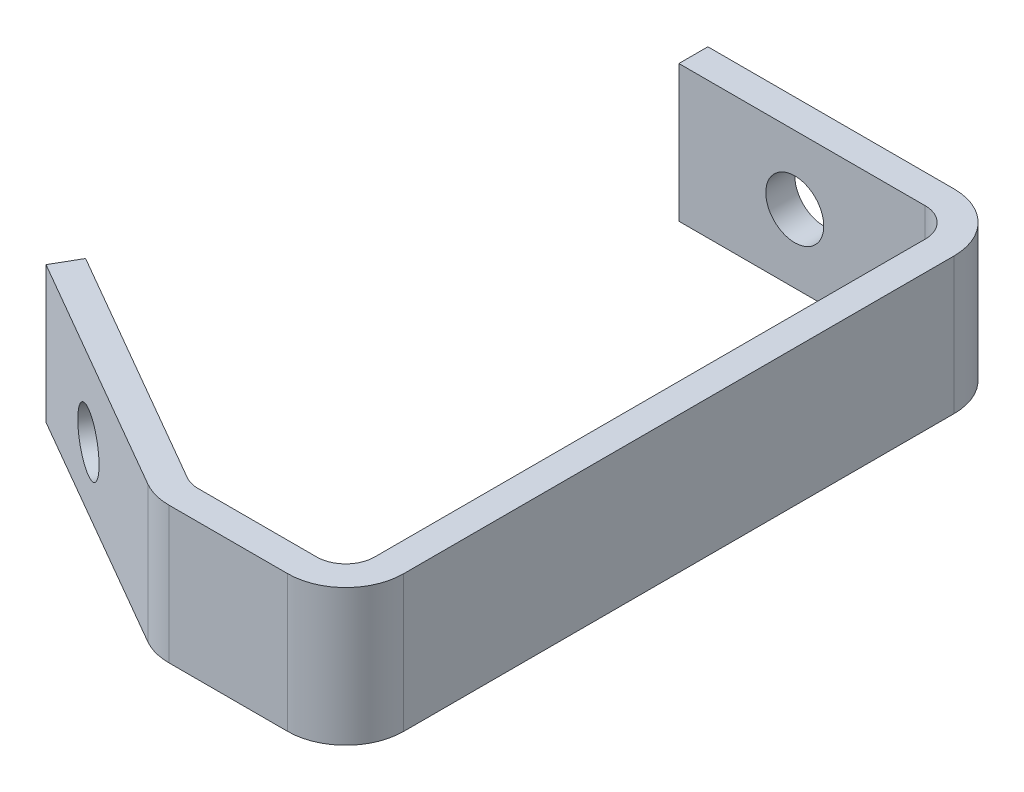
ISO-10303-21;
HEADER;
FILE_DESCRIPTION(('STEP AP214'),'2;1');
FILE_NAME('part.step','',(''),(''),'','','');
FILE_SCHEMA(('AUTOMOTIVE_DESIGN { 1 0 10303 214 1 1 1 1 }'));
ENDSEC;
DATA;
#1=APPLICATION_CONTEXT('core data for automotive mechanical design processes');
#2=APPLICATION_PROTOCOL_DEFINITION('international standard','automotive_design',2000,#1);
#3=PRODUCT_CONTEXT('',#1,'mechanical');
#4=PRODUCT('Part','Part','',(#3));
#5=PRODUCT_RELATED_PRODUCT_CATEGORY('part','',(#4));
#6=PRODUCT_DEFINITION_FORMATION('','',#4);
#7=PRODUCT_DEFINITION_CONTEXT('part definition',#1,'design');
#8=PRODUCT_DEFINITION('design','',#6,#7);
#9=PRODUCT_DEFINITION_SHAPE('','',#8);
#10=(LENGTH_UNIT() NAMED_UNIT(*) SI_UNIT(.MILLI.,.METRE.));
#11=(NAMED_UNIT(*) PLANE_ANGLE_UNIT() SI_UNIT($,.RADIAN.));
#12=(NAMED_UNIT(*) SI_UNIT($,.STERADIAN.) SOLID_ANGLE_UNIT());
#13=UNCERTAINTY_MEASURE_WITH_UNIT(LENGTH_MEASURE(1.E-05),#10,'distance_accuracy_value','');
#14=(GEOMETRIC_REPRESENTATION_CONTEXT(3) GLOBAL_UNCERTAINTY_ASSIGNED_CONTEXT((#13)) GLOBAL_UNIT_ASSIGNED_CONTEXT((#10,
#11,#12)) REPRESENTATION_CONTEXT('',''));
#15=CARTESIAN_POINT('',(0.,0.,0.));
#16=DIRECTION('',(0.,0.,1.));
#17=DIRECTION('',(1.,0.,0.));
#18=AXIS2_PLACEMENT_3D('',#15,#16,#17);
#19=CARTESIAN_POINT('',(-28.75,11.7879879437861,-2.16506350946109));
#20=DIRECTION('',(-0.500000000000001,0.,0.866025403784438));
#21=DIRECTION('',(0.866025403784438,0.,0.500000000000001));
#22=AXIS2_PLACEMENT_3D('',#19,#20,#21);
#23=PLANE('',#22);
#24=CARTESIAN_POINT('',(-54.7307621135332,-1.07656788950194,-17.1650635094611));
#25=DIRECTION('',(-0.500000000000001,0.,0.866025403784438));
#26=DIRECTION('',(0.866025403784438,0.,0.500000000000001));
#27=AXIS2_PLACEMENT_3D('',#24,#25,#26);
#28=CIRCLE('',#27,5.);
#29=CARTESIAN_POINT('',(-50.400635094611,-1.07656788950194,-14.6650635094611));
#30=VERTEX_POINT('',#29);
#31=EDGE_CURVE('E499',#30,#30,#28,.T.);
#32=ORIENTED_EDGE('',*,*,#31,.T.);
#33=EDGE_LOOP('',(#32));
#34=FACE_BOUND('',#33,.T.);
#35=DIRECTION('',(-0.866025403784438,0.,-0.500000000000001));
#36=VECTOR('',#35,1.);
#37=CARTESIAN_POINT('',(-28.75,11.7879879437861,-2.16506350946109));
#38=LINE('',#37,#36);
#39=CARTESIAN_POINT('',(-30.4903810567666,11.7879879437861,-3.1698729810778));
#40=VERTEX_POINT('',#39);
#41=CARTESIAN_POINT('',(-72.0512701892219,11.7879879437861,-27.1650635094611));
#42=VERTEX_POINT('',#41);
#43=EDGE_CURVE('E145',#40,#42,#38,.T.);
#44=ORIENTED_EDGE('',*,*,#43,.F.);
#45=DIRECTION('',(0.,-1.,0.));
#46=VECTOR('',#45,1.);
#47=CARTESIAN_POINT('',(-30.4903810567666,-11.7879879437861,-3.1698729810778));
#48=LINE('',#47,#46);
#49=CARTESIAN_POINT('',(-30.4903810567666,-11.7879879437861,-3.1698729810778));
#50=VERTEX_POINT('',#49);
#51=EDGE_CURVE('E260',#40,#50,#48,.T.);
#52=ORIENTED_EDGE('',*,*,#51,.T.);
#53=DIRECTION('',(-0.866025403784438,0.,-0.500000000000001));
#54=VECTOR('',#53,1.);
#55=CARTESIAN_POINT('',(-28.75,-11.7879879437861,-2.16506350946109));
#56=LINE('',#55,#54);
#57=CARTESIAN_POINT('',(-72.0512701892219,-11.7879879437861,-27.1650635094611));
#58=VERTEX_POINT('',#57);
#59=EDGE_CURVE('E161',#50,#58,#56,.T.);
#60=ORIENTED_EDGE('',*,*,#59,.T.);
#61=DIRECTION('',(0.,-1.,0.));
#62=VECTOR('',#61,1.);
#63=CARTESIAN_POINT('',(-72.0512701892219,11.7879879437861,-27.1650635094611));
#64=LINE('',#63,#62);
#65=EDGE_CURVE('E159',#42,#58,#64,.T.);
#66=ORIENTED_EDGE('',*,*,#65,.F.);
#67=EDGE_LOOP('',(#44,#52,#60,#66));
#68=FACE_BOUND('',#67,.T.);
#69=ADVANCED_FACE('F33',(#34,#68),#23,.F.);
#70=CARTESIAN_POINT('',(-74.551270189222,11.7879879437861,-22.834936490539));
#71=DIRECTION('',(-0.866025403784438,0.,-0.500000000000001));
#72=DIRECTION('',(-0.500000000000001,0.,0.866025403784438));
#73=AXIS2_PLACEMENT_3D('',#70,#71,#72);
#74=PLANE('',#73);
#75=DIRECTION('',(0.500000000000001,0.,-0.866025403784438));
#76=VECTOR('',#75,1.);
#77=CARTESIAN_POINT('',(-74.551270189222,-11.7879879437861,-22.834936490539));
#78=LINE('',#77,#76);
#79=CARTESIAN_POINT('',(-74.551270189222,-11.7879879437861,-22.834936490539));
#80=VERTEX_POINT('',#79);
#81=EDGE_CURVE('E198',#80,#58,#78,.T.);
#82=ORIENTED_EDGE('',*,*,#81,.F.);
#83=DIRECTION('',(0.,-1.,0.));
#84=VECTOR('',#83,1.);
#85=CARTESIAN_POINT('',(-74.551270189222,11.7879879437861,-22.834936490539));
#86=LINE('',#85,#84);
#87=CARTESIAN_POINT('',(-74.551270189222,11.7879879437861,-22.834936490539));
#88=VERTEX_POINT('',#87);
#89=EDGE_CURVE('E166',#88,#80,#86,.T.);
#90=ORIENTED_EDGE('',*,*,#89,.F.);
#91=DIRECTION('',(0.500000000000001,0.,-0.866025403784438));
#92=VECTOR('',#91,1.);
#93=CARTESIAN_POINT('',(-74.551270189222,11.7879879437861,-22.834936490539));
#94=LINE('',#93,#92);
#95=EDGE_CURVE('E149',#88,#42,#94,.T.);
#96=ORIENTED_EDGE('',*,*,#95,.T.);
#97=ORIENTED_EDGE('',*,*,#65,.T.);
#98=EDGE_LOOP('',(#82,#90,#96,#97));
#99=FACE_BOUND('',#98,.T.);
#100=ADVANCED_FACE('F169',(#99),#74,.T.);
#101=CARTESIAN_POINT('',(-31.25,11.7879879437861,2.1650635094611));
#102=DIRECTION('',(-0.500000000000001,0.,0.866025403784438));
#103=DIRECTION('',(0.866025403784438,0.,0.500000000000001));
#104=AXIS2_PLACEMENT_3D('',#101,#102,#103);
#105=PLANE('',#104);
#106=CARTESIAN_POINT('',(-57.2307621135332,-1.07656788950194,-12.8349364905389));
#107=DIRECTION('',(-0.500000000000001,0.,0.866025403784438));
#108=DIRECTION('',(0.866025403784438,0.,0.500000000000001));
#109=AXIS2_PLACEMENT_3D('',#106,#107,#108);
#110=CIRCLE('',#109,5.);
#111=CARTESIAN_POINT('',(-52.900635094611,-1.07656788950194,-10.3349364905389));
#112=VERTEX_POINT('',#111);
#113=EDGE_CURVE('E497',#112,#112,#110,.T.);
#114=ORIENTED_EDGE('',*,*,#113,.F.);
#115=EDGE_LOOP('',(#114));
#116=FACE_BOUND('',#115,.T.);
#117=DIRECTION('',(-0.866025403784438,0.,-0.500000000000001));
#118=VECTOR('',#117,1.);
#119=CARTESIAN_POINT('',(-31.25,-11.7879879437861,2.1650635094611));
#120=LINE('',#119,#118);
#121=CARTESIAN_POINT('',(-32.9903810567666,-11.7879879437861,1.16025403784439));
#122=VERTEX_POINT('',#121);
#123=EDGE_CURVE('E200',#122,#80,#120,.T.);
#124=ORIENTED_EDGE('',*,*,#123,.F.);
#125=DIRECTION('',(0.,-1.,0.));
#126=VECTOR('',#125,1.);
#127=CARTESIAN_POINT('',(-32.9903810567666,11.7879879437861,1.16025403784439));
#128=LINE('',#127,#126);
#129=CARTESIAN_POINT('',(-32.9903810567666,11.7879879437861,1.16025403784439));
#130=VERTEX_POINT('',#129);
#131=EDGE_CURVE('E42',#122,#130,#128,.F.);
#132=ORIENTED_EDGE('',*,*,#131,.T.);
#133=DIRECTION('',(-0.866025403784438,0.,-0.500000000000001));
#134=VECTOR('',#133,1.);
#135=CARTESIAN_POINT('',(-31.25,11.7879879437861,2.1650635094611));
#136=LINE('',#135,#134);
#137=EDGE_CURVE('E171',#130,#88,#136,.T.);
#138=ORIENTED_EDGE('',*,*,#137,.T.);
#139=ORIENTED_EDGE('',*,*,#89,.T.);
#140=EDGE_LOOP('',(#124,#132,#138,#139));
#141=FACE_BOUND('',#140,.T.);
#142=ADVANCED_FACE('F325',(#116,#141),#105,.T.);
#143=CARTESIAN_POINT('',(0.,11.7879879437861,2.5));
#144=DIRECTION('',(0.,0.,1.));
#145=DIRECTION('',(1.,0.,0.));
#146=AXIS2_PLACEMENT_3D('',#143,#144,#145);
#147=PLANE('',#146);
#148=DIRECTION('',(-1.,0.,0.));
#149=VECTOR('',#148,1.);
#150=CARTESIAN_POINT('',(0.,11.7879879437861,2.5));
#151=LINE('',#150,#149);
#152=CARTESIAN_POINT('',(-7.5,11.7879879437861,2.5));
#153=VERTEX_POINT('',#152);
#154=CARTESIAN_POINT('',(-27.9903810567666,11.7879879437861,2.50000000000001));
#155=VERTEX_POINT('',#154);
#156=EDGE_CURVE('E173',#153,#155,#151,.T.);
#157=ORIENTED_EDGE('',*,*,#156,.T.);
#158=DIRECTION('',(0.,-1.,0.));
#159=VECTOR('',#158,1.);
#160=CARTESIAN_POINT('',(-27.9903810567666,11.7879879437861,2.50000000000001));
#161=LINE('',#160,#159);
#162=CARTESIAN_POINT('',(-27.9903810567666,-11.7879879437861,2.50000000000001));
#163=VERTEX_POINT('',#162);
#164=EDGE_CURVE('E267',#155,#163,#161,.T.);
#165=ORIENTED_EDGE('',*,*,#164,.T.);
#166=DIRECTION('',(-1.,0.,0.));
#167=VECTOR('',#166,1.);
#168=CARTESIAN_POINT('',(0.,-11.7879879437861,2.5));
#169=LINE('',#168,#167);
#170=CARTESIAN_POINT('',(-7.5,-11.7879879437861,2.5));
#171=VERTEX_POINT('',#170);
#172=EDGE_CURVE('E202',#171,#163,#169,.T.);
#173=ORIENTED_EDGE('',*,*,#172,.F.);
#174=DIRECTION('',(0.,-1.,0.));
#175=VECTOR('',#174,1.);
#176=CARTESIAN_POINT('',(-7.5,11.7879879437861,2.5));
#177=LINE('',#176,#175);
#178=EDGE_CURVE('E247',#171,#153,#177,.F.);
#179=ORIENTED_EDGE('',*,*,#178,.T.);
#180=EDGE_LOOP('',(#157,#165,#173,#179));
#181=FACE_BOUND('',#180,.T.);
#182=ADVANCED_FACE('F274',(#181),#147,.T.);
#183=CARTESIAN_POINT('',(2.5,11.7879879437861,-110.));
#184=DIRECTION('',(1.,0.,0.));
#185=DIRECTION('',(0.,0.,-1.));
#186=AXIS2_PLACEMENT_3D('',#183,#184,#185);
#187=PLANE('',#186);
#188=DIRECTION('',(0.,0.,1.));
#189=VECTOR('',#188,1.);
#190=CARTESIAN_POINT('',(2.5,11.7879879437861,-110.));
#191=LINE('',#190,#189);
#192=CARTESIAN_POINT('',(2.5,11.7879879437861,-102.5));
#193=VERTEX_POINT('',#192);
#194=CARTESIAN_POINT('',(2.5,11.7879879437861,-7.49999999999999));
#195=VERTEX_POINT('',#194);
#196=EDGE_CURVE('E179',#193,#195,#191,.T.);
#197=ORIENTED_EDGE('',*,*,#196,.T.);
#198=DIRECTION('',(0.,-1.,0.));
#199=VECTOR('',#198,1.);
#200=CARTESIAN_POINT('',(2.5,11.7879879437861,-7.49999999999999));
#201=LINE('',#200,#199);
#202=CARTESIAN_POINT('',(2.5,-11.7879879437861,-7.49999999999999));
#203=VERTEX_POINT('',#202);
#204=EDGE_CURVE('E242',#195,#203,#201,.T.);
#205=ORIENTED_EDGE('',*,*,#204,.T.);
#206=DIRECTION('',(0.,0.,1.));
#207=VECTOR('',#206,1.);
#208=CARTESIAN_POINT('',(2.5,-11.7879879437861,-110.));
#209=LINE('',#208,#207);
#210=CARTESIAN_POINT('',(2.5,-11.7879879437861,-102.5));
#211=VERTEX_POINT('',#210);
#212=EDGE_CURVE('E204',#211,#203,#209,.T.);
#213=ORIENTED_EDGE('',*,*,#212,.F.);
#214=DIRECTION('',(0.,-1.,0.));
#215=VECTOR('',#214,1.);
#216=CARTESIAN_POINT('',(2.5,11.7879879437861,-102.5));
#217=LINE('',#216,#215);
#218=EDGE_CURVE('E238',#211,#193,#217,.F.);
#219=ORIENTED_EDGE('',*,*,#218,.T.);
#220=EDGE_LOOP('',(#197,#205,#213,#219));
#221=FACE_BOUND('',#220,.T.);
#222=ADVANCED_FACE('F286',(#221),#187,.T.);
#223=CARTESIAN_POINT('',(-50.,11.7879879437861,-112.5));
#224=DIRECTION('',(0.,0.,-1.));
#225=DIRECTION('',(-1.,0.,0.));
#226=AXIS2_PLACEMENT_3D('',#223,#224,#225);
#227=PLANE('',#226);
#228=CARTESIAN_POINT('',(-30.,0.,-112.5));
#229=DIRECTION('',(0.,0.,-1.));
#230=DIRECTION('',(-1.,0.,0.));
#231=AXIS2_PLACEMENT_3D('',#228,#229,#230);
#232=CIRCLE('',#231,5.);
#233=CARTESIAN_POINT('',(-35.,0.,-112.5));
#234=VERTEX_POINT('',#233);
#235=EDGE_CURVE('E500',#234,#234,#232,.T.);
#236=ORIENTED_EDGE('',*,*,#235,.F.);
#237=EDGE_LOOP('',(#236));
#238=FACE_BOUND('',#237,.T.);
#239=DIRECTION('',(1.,0.,0.));
#240=VECTOR('',#239,1.);
#241=CARTESIAN_POINT('',(-50.,11.7879879437861,-112.5));
#242=LINE('',#241,#240);
#243=CARTESIAN_POINT('',(-50.,11.7879879437861,-112.5));
#244=VERTEX_POINT('',#243);
#245=CARTESIAN_POINT('',(-7.5,11.7879879437861,-112.5));
#246=VERTEX_POINT('',#245);
#247=EDGE_CURVE('E182',#244,#246,#242,.T.);
#248=ORIENTED_EDGE('',*,*,#247,.T.);
#249=DIRECTION('',(0.,-1.,0.));
#250=VECTOR('',#249,1.);
#251=CARTESIAN_POINT('',(-7.5,11.7879879437861,-112.5));
#252=LINE('',#251,#250);
#253=CARTESIAN_POINT('',(-7.5,-11.7879879437861,-112.5));
#254=VERTEX_POINT('',#253);
#255=EDGE_CURVE('E233',#246,#254,#252,.T.);
#256=ORIENTED_EDGE('',*,*,#255,.T.);
#257=DIRECTION('',(1.,0.,0.));
#258=VECTOR('',#257,1.);
#259=CARTESIAN_POINT('',(-50.,-11.7879879437861,-112.5));
#260=LINE('',#259,#258);
#261=CARTESIAN_POINT('',(-50.,-11.7879879437861,-112.5));
#262=VERTEX_POINT('',#261);
#263=EDGE_CURVE('E207',#262,#254,#260,.T.);
#264=ORIENTED_EDGE('',*,*,#263,.F.);
#265=DIRECTION('',(0.,-1.,0.));
#266=VECTOR('',#265,1.);
#267=CARTESIAN_POINT('',(-50.,11.7879879437861,-112.5));
#268=LINE('',#267,#266);
#269=EDGE_CURVE('E222',#244,#262,#268,.T.);
#270=ORIENTED_EDGE('',*,*,#269,.F.);
#271=EDGE_LOOP('',(#248,#256,#264,#270));
#272=FACE_BOUND('',#271,.T.);
#273=ADVANCED_FACE('F296',(#238,#272),#227,.T.);
#274=CARTESIAN_POINT('',(-50.,11.7879879437861,-107.5));
#275=DIRECTION('',(-1.,0.,0.));
#276=DIRECTION('',(0.,0.,1.));
#277=AXIS2_PLACEMENT_3D('',#274,#275,#276);
#278=PLANE('',#277);
#279=DIRECTION('',(0.,0.,-1.));
#280=VECTOR('',#279,1.);
#281=CARTESIAN_POINT('',(-50.,-11.7879879437861,-107.5));
#282=LINE('',#281,#280);
#283=CARTESIAN_POINT('',(-50.,-11.7879879437861,-107.5));
#284=VERTEX_POINT('',#283);
#285=EDGE_CURVE('E210',#284,#262,#282,.T.);
#286=ORIENTED_EDGE('',*,*,#285,.F.);
#287=DIRECTION('',(0.,-1.,0.));
#288=VECTOR('',#287,1.);
#289=CARTESIAN_POINT('',(-50.,11.7879879437861,-107.5));
#290=LINE('',#289,#288);
#291=CARTESIAN_POINT('',(-50.,11.7879879437861,-107.5));
#292=VERTEX_POINT('',#291);
#293=EDGE_CURVE('E196',#292,#284,#290,.T.);
#294=ORIENTED_EDGE('',*,*,#293,.F.);
#295=DIRECTION('',(0.,0.,-1.));
#296=VECTOR('',#295,1.);
#297=CARTESIAN_POINT('',(-50.,11.7879879437861,-107.5));
#298=LINE('',#297,#296);
#299=EDGE_CURVE('E185',#292,#244,#298,.T.);
#300=ORIENTED_EDGE('',*,*,#299,.T.);
#301=ORIENTED_EDGE('',*,*,#269,.T.);
#302=EDGE_LOOP('',(#286,#294,#300,#301));
#303=FACE_BOUND('',#302,.T.);
#304=ADVANCED_FACE('F300',(#303),#278,.T.);
#305=CARTESIAN_POINT('',(-50.,11.7879879437861,-107.5));
#306=DIRECTION('',(0.,0.,-1.));
#307=DIRECTION('',(-1.,0.,0.));
#308=AXIS2_PLACEMENT_3D('',#305,#306,#307);
#309=PLANE('',#308);
#310=CARTESIAN_POINT('',(-30.,0.,-107.5));
#311=DIRECTION('',(0.,0.,-1.));
#312=DIRECTION('',(-1.,0.,0.));
#313=AXIS2_PLACEMENT_3D('',#310,#311,#312);
#314=CIRCLE('',#313,5.);
#315=CARTESIAN_POINT('',(-35.,0.,-107.5));
#316=VERTEX_POINT('',#315);
#317=EDGE_CURVE('E37',#316,#316,#314,.T.);
#318=ORIENTED_EDGE('',*,*,#317,.T.);
#319=EDGE_LOOP('',(#318));
#320=FACE_BOUND('',#319,.T.);
#321=DIRECTION('',(1.,0.,0.));
#322=VECTOR('',#321,1.);
#323=CARTESIAN_POINT('',(-50.,-11.7879879437861,-107.5));
#324=LINE('',#323,#322);
#325=CARTESIAN_POINT('',(-7.5,-11.7879879437861,-107.5));
#326=VERTEX_POINT('',#325);
#327=EDGE_CURVE('E213',#284,#326,#324,.T.);
#328=ORIENTED_EDGE('',*,*,#327,.T.);
#329=DIRECTION('',(0.,-1.,0.));
#330=VECTOR('',#329,1.);
#331=CARTESIAN_POINT('',(-7.5,11.7879879437861,-107.5));
#332=LINE('',#331,#330);
#333=CARTESIAN_POINT('',(-7.5,11.7879879437861,-107.5));
#334=VERTEX_POINT('',#333);
#335=EDGE_CURVE('E227',#326,#334,#332,.F.);
#336=ORIENTED_EDGE('',*,*,#335,.T.);
#337=DIRECTION('',(1.,0.,0.));
#338=VECTOR('',#337,1.);
#339=CARTESIAN_POINT('',(-50.,11.7879879437861,-107.5));
#340=LINE('',#339,#338);
#341=EDGE_CURVE('E188',#292,#334,#340,.T.);
#342=ORIENTED_EDGE('',*,*,#341,.F.);
#343=ORIENTED_EDGE('',*,*,#293,.T.);
#344=EDGE_LOOP('',(#328,#336,#342,#343));
#345=FACE_BOUND('',#344,.T.);
#346=ADVANCED_FACE('F415',(#320,#345),#309,.F.);
#347=CARTESIAN_POINT('',(-2.5,11.7879879437861,-110.));
#348=DIRECTION('',(1.,0.,0.));
#349=DIRECTION('',(0.,0.,-1.));
#350=AXIS2_PLACEMENT_3D('',#347,#348,#349);
#351=PLANE('',#350);
#352=DIRECTION('',(0.,0.,1.));
#353=VECTOR('',#352,1.);
#354=CARTESIAN_POINT('',(-2.5,-11.7879879437861,-110.));
#355=LINE('',#354,#353);
#356=CARTESIAN_POINT('',(-2.5,-11.7879879437861,-102.5));
#357=VERTEX_POINT('',#356);
#358=CARTESIAN_POINT('',(-2.5,-11.7879879437861,-7.49999999999999));
#359=VERTEX_POINT('',#358);
#360=EDGE_CURVE('E216',#357,#359,#355,.T.);
#361=ORIENTED_EDGE('',*,*,#360,.T.);
#362=DIRECTION('',(0.,-1.,0.));
#363=VECTOR('',#362,1.);
#364=CARTESIAN_POINT('',(-2.5,11.7879879437861,-7.5));
#365=LINE('',#364,#363);
#366=CARTESIAN_POINT('',(-2.5,11.7879879437861,-7.49999999999999));
#367=VERTEX_POINT('',#366);
#368=EDGE_CURVE('E254',#359,#367,#365,.F.);
#369=ORIENTED_EDGE('',*,*,#368,.T.);
#370=DIRECTION('',(0.,0.,1.));
#371=VECTOR('',#370,1.);
#372=CARTESIAN_POINT('',(-2.5,11.7879879437861,-110.));
#373=LINE('',#372,#371);
#374=CARTESIAN_POINT('',(-2.5,11.7879879437861,-102.5));
#375=VERTEX_POINT('',#374);
#376=EDGE_CURVE('E191',#375,#367,#373,.T.);
#377=ORIENTED_EDGE('',*,*,#376,.F.);
#378=DIRECTION('',(0.,-1.,0.));
#379=VECTOR('',#378,1.);
#380=CARTESIAN_POINT('',(-2.5,-11.7879879437861,-102.5));
#381=LINE('',#380,#379);
#382=EDGE_CURVE('E165',#375,#357,#381,.T.);
#383=ORIENTED_EDGE('',*,*,#382,.T.);
#384=EDGE_LOOP('',(#361,#369,#377,#383));
#385=FACE_BOUND('',#384,.T.);
#386=ADVANCED_FACE('F312',(#385),#351,.F.);
#387=CARTESIAN_POINT('',(0.,11.7879879437861,-2.5));
#388=DIRECTION('',(0.,0.,1.));
#389=DIRECTION('',(1.,0.,0.));
#390=AXIS2_PLACEMENT_3D('',#387,#388,#389);
#391=PLANE('',#390);
#392=DIRECTION('',(-1.,0.,0.));
#393=VECTOR('',#392,1.);
#394=CARTESIAN_POINT('',(0.,-11.7879879437861,-2.5));
#395=LINE('',#394,#393);
#396=CARTESIAN_POINT('',(-7.5,-11.7879879437861,-2.5));
#397=VERTEX_POINT('',#396);
#398=CARTESIAN_POINT('',(-27.9903810567666,-11.7879879437861,-2.49999999999999));
#399=VERTEX_POINT('',#398);
#400=EDGE_CURVE('E156',#397,#399,#395,.T.);
#401=ORIENTED_EDGE('',*,*,#400,.T.);
#402=DIRECTION('',(0.,-1.,0.));
#403=VECTOR('',#402,1.);
#404=CARTESIAN_POINT('',(-27.9903810567666,11.7879879437861,-2.49999999999999));
#405=LINE('',#404,#403);
#406=CARTESIAN_POINT('',(-27.9903810567666,11.7879879437861,-2.49999999999999));
#407=VERTEX_POINT('',#406);
#408=EDGE_CURVE('E262',#399,#407,#405,.F.);
#409=ORIENTED_EDGE('',*,*,#408,.T.);
#410=DIRECTION('',(-1.,0.,0.));
#411=VECTOR('',#410,1.);
#412=CARTESIAN_POINT('',(0.,11.7879879437861,-2.5));
#413=LINE('',#412,#411);
#414=CARTESIAN_POINT('',(-7.5,11.7879879437861,-2.5));
#415=VERTEX_POINT('',#414);
#416=EDGE_CURVE('E194',#415,#407,#413,.T.);
#417=ORIENTED_EDGE('',*,*,#416,.F.);
#418=DIRECTION('',(0.,-1.,0.));
#419=VECTOR('',#418,1.);
#420=CARTESIAN_POINT('',(-7.5,-11.7879879437861,-2.5));
#421=LINE('',#420,#419);
#422=EDGE_CURVE('E251',#415,#397,#421,.T.);
#423=ORIENTED_EDGE('',*,*,#422,.T.);
#424=EDGE_LOOP('',(#401,#409,#417,#423));
#425=FACE_BOUND('',#424,.T.);
#426=ADVANCED_FACE('F321',(#425),#391,.F.);
#427=CARTESIAN_POINT('',(0.,11.7879879437861,0.));
#428=DIRECTION('',(0.,-1.,0.));
#429=DIRECTION('',(-1.,0.,0.));
#430=AXIS2_PLACEMENT_3D('',#427,#428,#429);
#431=PLANE('',#430);
#432=ORIENTED_EDGE('',*,*,#137,.F.);
#433=CARTESIAN_POINT('',(-27.9903810567666,11.7879879437861,-7.49999999999999));
#434=DIRECTION('',(0.,-1.,0.));
#435=DIRECTION('',(0.,0.,-1.));
#436=AXIS2_PLACEMENT_3D('',#433,#434,#435);
#437=CIRCLE('',#436,10.);
#438=EDGE_CURVE('E11',#130,#155,#437,.F.);
#439=ORIENTED_EDGE('',*,*,#438,.T.);
#440=ORIENTED_EDGE('',*,*,#156,.F.);
#441=CARTESIAN_POINT('',(-7.5,11.7879879437861,-7.49999999999999));
#442=DIRECTION('',(0.,-1.,0.));
#443=DIRECTION('',(0.,0.,-1.));
#444=AXIS2_PLACEMENT_3D('',#441,#442,#443);
#445=CIRCLE('',#444,10.);
#446=EDGE_CURVE('E249',#153,#195,#445,.F.);
#447=ORIENTED_EDGE('',*,*,#446,.T.);
#448=ORIENTED_EDGE('',*,*,#196,.F.);
#449=CARTESIAN_POINT('',(-7.5,11.7879879437861,-102.5));
#450=DIRECTION('',(0.,-1.,0.));
#451=DIRECTION('',(0.,0.,-1.));
#452=AXIS2_PLACEMENT_3D('',#449,#450,#451);
#453=CIRCLE('',#452,10.);
#454=EDGE_CURVE('E240',#193,#246,#453,.F.);
#455=ORIENTED_EDGE('',*,*,#454,.T.);
#456=ORIENTED_EDGE('',*,*,#247,.F.);
#457=ORIENTED_EDGE('',*,*,#299,.F.);
#458=ORIENTED_EDGE('',*,*,#341,.T.);
#459=CARTESIAN_POINT('',(-7.5,11.7879879437861,-102.5));
#460=DIRECTION('',(0.,-1.,0.));
#461=DIRECTION('',(0.,0.,-1.));
#462=AXIS2_PLACEMENT_3D('',#459,#460,#461);
#463=CIRCLE('',#462,5.);
#464=EDGE_CURVE('E231',#334,#375,#463,.T.);
#465=ORIENTED_EDGE('',*,*,#464,.T.);
#466=ORIENTED_EDGE('',*,*,#376,.T.);
#467=CARTESIAN_POINT('',(-7.5,11.7879879437861,-7.5));
#468=DIRECTION('',(0.,-1.,0.));
#469=DIRECTION('',(0.,0.,-1.));
#470=AXIS2_PLACEMENT_3D('',#467,#468,#469);
#471=CIRCLE('',#470,5.);
#472=EDGE_CURVE('E258',#367,#415,#471,.T.);
#473=ORIENTED_EDGE('',*,*,#472,.T.);
#474=ORIENTED_EDGE('',*,*,#416,.T.);
#475=CARTESIAN_POINT('',(-27.9903810567666,11.7879879437861,-7.49999999999999));
#476=DIRECTION('',(0.,-1.,0.));
#477=DIRECTION('',(0.,0.,-1.));
#478=AXIS2_PLACEMENT_3D('',#475,#476,#477);
#479=CIRCLE('',#478,5.);
#480=EDGE_CURVE('E152',#407,#40,#479,.T.);
#481=ORIENTED_EDGE('',*,*,#480,.T.);
#482=ORIENTED_EDGE('',*,*,#43,.T.);
#483=ORIENTED_EDGE('',*,*,#95,.F.);
#484=EDGE_LOOP('',(#432,#439,#440,#447,#448,#455,#456,#457,#458,#465,#466,#473,#474,#481,#482,#483));
#485=FACE_BOUND('',#484,.T.);
#486=ADVANCED_FACE('F147',(#485),#431,.F.);
#487=CARTESIAN_POINT('',(0.,-11.7879879437861,0.));
#488=DIRECTION('',(0.,-1.,0.));
#489=DIRECTION('',(-1.,0.,0.));
#490=AXIS2_PLACEMENT_3D('',#487,#488,#489);
#491=PLANE('',#490);
#492=ORIENTED_EDGE('',*,*,#172,.T.);
#493=CARTESIAN_POINT('',(-27.9903810567666,-11.7879879437861,-7.49999999999999));
#494=DIRECTION('',(0.,-1.,0.));
#495=DIRECTION('',(0.,0.,-1.));
#496=AXIS2_PLACEMENT_3D('',#493,#494,#495);
#497=CIRCLE('',#496,10.);
#498=EDGE_CURVE('E56',#163,#122,#497,.T.);
#499=ORIENTED_EDGE('',*,*,#498,.T.);
#500=ORIENTED_EDGE('',*,*,#123,.T.);
#501=ORIENTED_EDGE('',*,*,#81,.T.);
#502=ORIENTED_EDGE('',*,*,#59,.F.);
#503=CARTESIAN_POINT('',(-27.9903810567666,-11.7879879437861,-7.49999999999999));
#504=DIRECTION('',(0.,-1.,0.));
#505=DIRECTION('',(0.,0.,-1.));
#506=AXIS2_PLACEMENT_3D('',#503,#504,#505);
#507=CIRCLE('',#506,5.);
#508=EDGE_CURVE('E264',#50,#399,#507,.F.);
#509=ORIENTED_EDGE('',*,*,#508,.T.);
#510=ORIENTED_EDGE('',*,*,#400,.F.);
#511=CARTESIAN_POINT('',(-7.5,-11.7879879437861,-7.5));
#512=DIRECTION('',(0.,-1.,0.));
#513=DIRECTION('',(0.,0.,-1.));
#514=AXIS2_PLACEMENT_3D('',#511,#512,#513);
#515=CIRCLE('',#514,5.);
#516=EDGE_CURVE('E256',#397,#359,#515,.F.);
#517=ORIENTED_EDGE('',*,*,#516,.T.);
#518=ORIENTED_EDGE('',*,*,#360,.F.);
#519=CARTESIAN_POINT('',(-7.5,-11.7879879437861,-102.5));
#520=DIRECTION('',(0.,-1.,0.));
#521=DIRECTION('',(0.,0.,-1.));
#522=AXIS2_PLACEMENT_3D('',#519,#520,#521);
#523=CIRCLE('',#522,5.);
#524=EDGE_CURVE('E229',#357,#326,#523,.F.);
#525=ORIENTED_EDGE('',*,*,#524,.T.);
#526=ORIENTED_EDGE('',*,*,#327,.F.);
#527=ORIENTED_EDGE('',*,*,#285,.T.);
#528=ORIENTED_EDGE('',*,*,#263,.T.);
#529=CARTESIAN_POINT('',(-7.5,-11.7879879437861,-102.5));
#530=DIRECTION('',(0.,-1.,0.));
#531=DIRECTION('',(0.,0.,-1.));
#532=AXIS2_PLACEMENT_3D('',#529,#530,#531);
#533=CIRCLE('',#532,10.);
#534=EDGE_CURVE('E236',#254,#211,#533,.T.);
#535=ORIENTED_EDGE('',*,*,#534,.T.);
#536=ORIENTED_EDGE('',*,*,#212,.T.);
#537=CARTESIAN_POINT('',(-7.5,-11.7879879437861,-7.49999999999999));
#538=DIRECTION('',(0.,-1.,0.));
#539=DIRECTION('',(0.,0.,-1.));
#540=AXIS2_PLACEMENT_3D('',#537,#538,#539);
#541=CIRCLE('',#540,10.);
#542=EDGE_CURVE('E245',#203,#171,#541,.T.);
#543=ORIENTED_EDGE('',*,*,#542,.T.);
#544=EDGE_LOOP('',(#492,#499,#500,#501,#502,#509,#510,#517,#518,#525,#526,#527,#528,#535,#536,#543));
#545=FACE_BOUND('',#544,.T.);
#546=ADVANCED_FACE('F279',(#545),#491,.T.);
#547=CARTESIAN_POINT('',(-7.5,11.7879879437861,-102.5));
#548=DIRECTION('',(0.,1.,0.));
#549=DIRECTION('',(0.,0.,1.));
#550=AXIS2_PLACEMENT_3D('',#547,#548,#549);
#551=CYLINDRICAL_SURFACE('',#550,5.);
#552=ORIENTED_EDGE('',*,*,#464,.F.);
#553=ORIENTED_EDGE('',*,*,#335,.F.);
#554=ORIENTED_EDGE('',*,*,#524,.F.);
#555=ORIENTED_EDGE('',*,*,#382,.F.);
#556=EDGE_LOOP('',(#552,#553,#554,#555));
#557=FACE_BOUND('',#556,.T.);
#558=ADVANCED_FACE('F309',(#557),#551,.F.);
#559=CARTESIAN_POINT('',(-7.5,11.7879879437861,-102.5));
#560=DIRECTION('',(0.,-1.,0.));
#561=DIRECTION('',(0.,0.,-1.));
#562=AXIS2_PLACEMENT_3D('',#559,#560,#561);
#563=CYLINDRICAL_SURFACE('',#562,10.);
#564=ORIENTED_EDGE('',*,*,#454,.F.);
#565=ORIENTED_EDGE('',*,*,#218,.F.);
#566=ORIENTED_EDGE('',*,*,#534,.F.);
#567=ORIENTED_EDGE('',*,*,#255,.F.);
#568=EDGE_LOOP('',(#564,#565,#566,#567));
#569=FACE_BOUND('',#568,.T.);
#570=ADVANCED_FACE('F293',(#569),#563,.T.);
#571=CARTESIAN_POINT('',(-7.5,11.7879879437861,-7.49999999999999));
#572=DIRECTION('',(0.,-1.,0.));
#573=DIRECTION('',(0.,0.,-1.));
#574=AXIS2_PLACEMENT_3D('',#571,#572,#573);
#575=CYLINDRICAL_SURFACE('',#574,10.);
#576=ORIENTED_EDGE('',*,*,#446,.F.);
#577=ORIENTED_EDGE('',*,*,#178,.F.);
#578=ORIENTED_EDGE('',*,*,#542,.F.);
#579=ORIENTED_EDGE('',*,*,#204,.F.);
#580=EDGE_LOOP('',(#576,#577,#578,#579));
#581=FACE_BOUND('',#580,.T.);
#582=ADVANCED_FACE('F284',(#581),#575,.T.);
#583=CARTESIAN_POINT('',(-7.5,11.7879879437861,-7.5));
#584=DIRECTION('',(0.,1.,0.));
#585=DIRECTION('',(0.,0.,1.));
#586=AXIS2_PLACEMENT_3D('',#583,#584,#585);
#587=CYLINDRICAL_SURFACE('',#586,5.);
#588=ORIENTED_EDGE('',*,*,#472,.F.);
#589=ORIENTED_EDGE('',*,*,#368,.F.);
#590=ORIENTED_EDGE('',*,*,#516,.F.);
#591=ORIENTED_EDGE('',*,*,#422,.F.);
#592=EDGE_LOOP('',(#588,#589,#590,#591));
#593=FACE_BOUND('',#592,.T.);
#594=ADVANCED_FACE('F318',(#593),#587,.F.);
#595=CARTESIAN_POINT('',(-27.9903810567666,11.7879879437861,-7.49999999999999));
#596=DIRECTION('',(0.,1.,0.));
#597=DIRECTION('',(0.,0.,1.));
#598=AXIS2_PLACEMENT_3D('',#595,#596,#597);
#599=CYLINDRICAL_SURFACE('',#598,5.);
#600=ORIENTED_EDGE('',*,*,#480,.F.);
#601=ORIENTED_EDGE('',*,*,#408,.F.);
#602=ORIENTED_EDGE('',*,*,#508,.F.);
#603=ORIENTED_EDGE('',*,*,#51,.F.);
#604=EDGE_LOOP('',(#600,#601,#602,#603));
#605=FACE_BOUND('',#604,.T.);
#606=ADVANCED_FACE('F324',(#605),#599,.F.);
#607=CARTESIAN_POINT('',(-27.9903810567666,11.7879879437861,-7.49999999999999));
#608=DIRECTION('',(0.,-1.,0.));
#609=DIRECTION('',(0.,0.,-1.));
#610=AXIS2_PLACEMENT_3D('',#607,#608,#609);
#611=CYLINDRICAL_SURFACE('',#610,10.);
#612=ORIENTED_EDGE('',*,*,#438,.F.);
#613=ORIENTED_EDGE('',*,*,#131,.F.);
#614=ORIENTED_EDGE('',*,*,#498,.F.);
#615=ORIENTED_EDGE('',*,*,#164,.F.);
#616=EDGE_LOOP('',(#612,#613,#614,#615));
#617=FACE_BOUND('',#616,.T.);
#618=ADVANCED_FACE('F35',(#617),#611,.T.);
#619=CARTESIAN_POINT('',(-30.,0.,-102.5));
#620=DIRECTION('',(0.,0.,-1.));
#621=DIRECTION('',(-1.,0.,0.));
#622=AXIS2_PLACEMENT_3D('',#619,#620,#621);
#623=CYLINDRICAL_SURFACE('',#622,5.);
#624=ORIENTED_EDGE('',*,*,#235,.T.);
#625=EDGE_LOOP('',(#624));
#626=FACE_BOUND('',#625,.T.);
#627=ORIENTED_EDGE('',*,*,#317,.F.);
#628=EDGE_LOOP('',(#627));
#629=FACE_BOUND('',#628,.T.);
#630=ADVANCED_FACE('F327',(#626,#629),#623,.F.);
#631=CARTESIAN_POINT('',(-52.2307621135331,-1.07656788950194,-21.4951905283833));
#632=DIRECTION('',(-0.500000000000001,0.,0.866025403784438));
#633=DIRECTION('',(0.866025403784438,0.,0.500000000000001));
#634=AXIS2_PLACEMENT_3D('',#631,#632,#633);
#635=CYLINDRICAL_SURFACE('',#634,5.);
#636=ORIENTED_EDGE('',*,*,#113,.T.);
#637=EDGE_LOOP('',(#636));
#638=FACE_BOUND('',#637,.T.);
#639=ORIENTED_EDGE('',*,*,#31,.F.);
#640=EDGE_LOOP('',(#639));
#641=FACE_BOUND('',#640,.T.);
#642=ADVANCED_FACE('F332',(#638,#641),#635,.F.);
#643=CLOSED_SHELL('',(#69,#100,#142,#182,#222,#273,#304,#346,#386,#426,#486,#546,#558,#570,#582,
#594,#606,#618,#630,#642));
#644=MANIFOLD_SOLID_BREP('B2',#643);
#645=ADVANCED_BREP_SHAPE_REPRESENTATION('',(#18,#644),#14);
#646=SHAPE_DEFINITION_REPRESENTATION(#9,#645);
ENDSEC;
END-ISO-10303-21;
